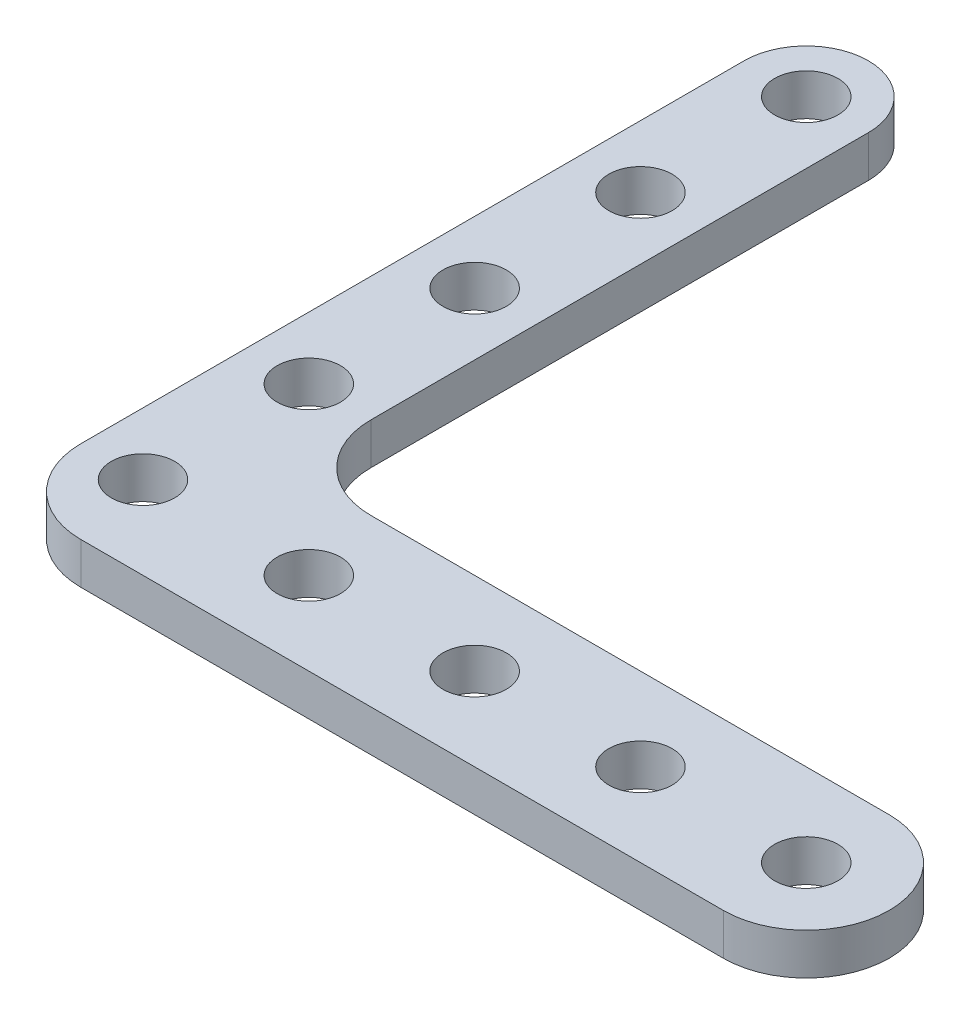
ISO-10303-21;
HEADER;
FILE_DESCRIPTION(('STEP AP214'),'2;1');
FILE_NAME('part.step','',(''),(''),'','','');
FILE_SCHEMA(('AUTOMOTIVE_DESIGN { 1 0 10303 214 1 1 1 1 }'));
ENDSEC;
DATA;
#1=APPLICATION_CONTEXT('core data for automotive mechanical design processes');
#2=APPLICATION_PROTOCOL_DEFINITION('international standard','automotive_design',2000,#1);
#3=PRODUCT_CONTEXT('',#1,'mechanical');
#4=PRODUCT('Part','Part','',(#3));
#5=PRODUCT_RELATED_PRODUCT_CATEGORY('part','',(#4));
#6=PRODUCT_DEFINITION_FORMATION('','',#4);
#7=PRODUCT_DEFINITION_CONTEXT('part definition',#1,'design');
#8=PRODUCT_DEFINITION('design','',#6,#7);
#9=PRODUCT_DEFINITION_SHAPE('','',#8);
#10=(LENGTH_UNIT() NAMED_UNIT(*) SI_UNIT(.MILLI.,.METRE.));
#11=(NAMED_UNIT(*) PLANE_ANGLE_UNIT() SI_UNIT($,.RADIAN.));
#12=(NAMED_UNIT(*) SI_UNIT($,.STERADIAN.) SOLID_ANGLE_UNIT());
#13=UNCERTAINTY_MEASURE_WITH_UNIT(LENGTH_MEASURE(1.E-05),#10,'distance_accuracy_value','');
#14=(GEOMETRIC_REPRESENTATION_CONTEXT(3) GLOBAL_UNCERTAINTY_ASSIGNED_CONTEXT((#13)) GLOBAL_UNIT_ASSIGNED_CONTEXT((#10,
#11,#12)) REPRESENTATION_CONTEXT('',''));
#15=CARTESIAN_POINT('',(0.,0.,0.));
#16=DIRECTION('',(0.,0.,1.));
#17=DIRECTION('',(1.,0.,0.));
#18=AXIS2_PLACEMENT_3D('',#15,#16,#17);
#19=CARTESIAN_POINT('',(-203.2,-28.575,1238.25));
#20=DIRECTION('',(0.,0.,1.));
#21=DIRECTION('',(1.,0.,0.));
#22=AXIS2_PLACEMENT_3D('',#19,#20,#21);
#23=PLANE('',#22);
#24=DIRECTION('',(1.,0.,0.));
#25=VECTOR('',#24,1.);
#26=CARTESIAN_POINT('',(-203.2,-25.4,1238.25));
#27=LINE('',#26,#25);
#28=CARTESIAN_POINT('',(-227.0125,-25.4,1238.25));
#29=VERTEX_POINT('',#28);
#30=CARTESIAN_POINT('',(-177.8,-25.4,1238.25));
#31=VERTEX_POINT('',#30);
#32=EDGE_CURVE('E146',#29,#31,#27,.T.);
#33=ORIENTED_EDGE('',*,*,#32,.F.);
#34=DIRECTION('',(0.,-1.,0.));
#35=VECTOR('',#34,1.);
#36=CARTESIAN_POINT('',(-227.0125,-28.575,1238.25));
#37=LINE('',#36,#35);
#38=CARTESIAN_POINT('',(-227.0125,-28.575,1238.25));
#39=VERTEX_POINT('',#38);
#40=EDGE_CURVE('E25',#29,#39,#37,.T.);
#41=ORIENTED_EDGE('',*,*,#40,.T.);
#42=DIRECTION('',(1.,0.,0.));
#43=VECTOR('',#42,1.);
#44=CARTESIAN_POINT('',(-203.2,-28.575,1238.25));
#45=LINE('',#44,#43);
#46=CARTESIAN_POINT('',(-177.8,-28.575,1238.25));
#47=VERTEX_POINT('',#46);
#48=EDGE_CURVE('E110',#39,#47,#45,.T.);
#49=ORIENTED_EDGE('',*,*,#48,.T.);
#50=DIRECTION('',(0.,1.,0.));
#51=VECTOR('',#50,1.);
#52=CARTESIAN_POINT('',(-177.8,-28.575,1238.25));
#53=LINE('',#52,#51);
#54=EDGE_CURVE('E92',#47,#31,#53,.T.);
#55=ORIENTED_EDGE('',*,*,#54,.T.);
#56=EDGE_LOOP('',(#33,#41,#49,#55));
#57=FACE_BOUND('',#56,.T.);
#58=ADVANCED_FACE('F17',(#57),#23,.T.);
#59=CARTESIAN_POINT('',(-233.3625,-28.575,1206.5));
#60=DIRECTION('',(-1.,0.,0.));
#61=DIRECTION('',(0.,0.,1.));
#62=AXIS2_PLACEMENT_3D('',#59,#60,#61);
#63=PLANE('',#62);
#64=DIRECTION('',(0.,0.,1.));
#65=VECTOR('',#64,1.);
#66=CARTESIAN_POINT('',(-233.3625,-25.4,1206.5));
#67=LINE('',#66,#65);
#68=CARTESIAN_POINT('',(-233.3625,-25.4,1181.1));
#69=VERTEX_POINT('',#68);
#70=CARTESIAN_POINT('',(-233.3625,-25.4,1231.9));
#71=VERTEX_POINT('',#70);
#72=EDGE_CURVE('E163',#69,#71,#67,.T.);
#73=ORIENTED_EDGE('',*,*,#72,.F.);
#74=DIRECTION('',(0.,1.,0.));
#75=VECTOR('',#74,1.);
#76=CARTESIAN_POINT('',(-233.3625,-28.575,1181.1));
#77=LINE('',#76,#75);
#78=CARTESIAN_POINT('',(-233.3625,-28.575,1181.1));
#79=VERTEX_POINT('',#78);
#80=EDGE_CURVE('E194',#79,#69,#77,.T.);
#81=ORIENTED_EDGE('',*,*,#80,.F.);
#82=DIRECTION('',(0.,0.,1.));
#83=VECTOR('',#82,1.);
#84=CARTESIAN_POINT('',(-233.3625,-28.575,1206.5));
#85=LINE('',#84,#83);
#86=CARTESIAN_POINT('',(-233.3625,-28.575,1231.9));
#87=VERTEX_POINT('',#86);
#88=EDGE_CURVE('E122',#79,#87,#85,.T.);
#89=ORIENTED_EDGE('',*,*,#88,.T.);
#90=DIRECTION('',(0.,1.,0.));
#91=VECTOR('',#90,1.);
#92=CARTESIAN_POINT('',(-233.3625,-28.575,1231.9));
#93=LINE('',#92,#91);
#94=EDGE_CURVE('E196',#87,#71,#93,.T.);
#95=ORIENTED_EDGE('',*,*,#94,.T.);
#96=EDGE_LOOP('',(#73,#81,#89,#95));
#97=FACE_BOUND('',#96,.T.);
#98=ADVANCED_FACE('F213',(#97),#63,.T.);
#99=CARTESIAN_POINT('',(-228.6,-28.575,1181.1));
#100=DIRECTION('',(0.,1.,0.));
#101=DIRECTION('',(0.,0.,1.));
#102=AXIS2_PLACEMENT_3D('',#99,#100,#101);
#103=CYLINDRICAL_SURFACE('',#102,4.7625);
#104=CARTESIAN_POINT('',(-228.6,-25.4,1181.1));
#105=DIRECTION('',(0.,-1.,0.));
#106=DIRECTION('',(0.,0.,-1.));
#107=AXIS2_PLACEMENT_3D('',#104,#105,#106);
#108=CIRCLE('',#107,4.7625);
#109=CARTESIAN_POINT('',(-223.8375,-25.4,1181.1));
#110=VERTEX_POINT('',#109);
#111=EDGE_CURVE('E165',#69,#110,#108,.T.);
#112=ORIENTED_EDGE('',*,*,#111,.T.);
#113=DIRECTION('',(0.,1.,0.));
#114=VECTOR('',#113,1.);
#115=CARTESIAN_POINT('',(-223.8375,-28.575,1181.1));
#116=LINE('',#115,#114);
#117=CARTESIAN_POINT('',(-223.8375,-28.575,1181.1));
#118=VERTEX_POINT('',#117);
#119=EDGE_CURVE('E192',#118,#110,#116,.T.);
#120=ORIENTED_EDGE('',*,*,#119,.F.);
#121=CARTESIAN_POINT('',(-228.6,-28.575,1181.1));
#122=DIRECTION('',(0.,-1.,0.));
#123=DIRECTION('',(0.,0.,-1.));
#124=AXIS2_PLACEMENT_3D('',#121,#122,#123);
#125=CIRCLE('',#124,4.7625);
#126=EDGE_CURVE('E125',#79,#118,#125,.T.);
#127=ORIENTED_EDGE('',*,*,#126,.F.);
#128=ORIENTED_EDGE('',*,*,#80,.T.);
#129=EDGE_LOOP('',(#112,#120,#127,#128));
#130=FACE_BOUND('',#129,.T.);
#131=ADVANCED_FACE('F219',(#130),#103,.T.);
#132=CARTESIAN_POINT('',(-223.8375,-28.575,1200.15));
#133=DIRECTION('',(1.,0.,0.));
#134=DIRECTION('',(0.,0.,-1.));
#135=AXIS2_PLACEMENT_3D('',#132,#133,#134);
#136=PLANE('',#135);
#137=DIRECTION('',(0.,0.,-1.));
#138=VECTOR('',#137,1.);
#139=CARTESIAN_POINT('',(-223.8375,-25.4,1200.15));
#140=LINE('',#139,#138);
#141=CARTESIAN_POINT('',(-223.8375,-25.4,1219.2));
#142=VERTEX_POINT('',#141);
#143=EDGE_CURVE('E168',#142,#110,#140,.T.);
#144=ORIENTED_EDGE('',*,*,#143,.F.);
#145=DIRECTION('',(0.,1.,0.));
#146=VECTOR('',#145,1.);
#147=CARTESIAN_POINT('',(-223.8375,-28.575,1219.2));
#148=LINE('',#147,#146);
#149=CARTESIAN_POINT('',(-223.8375,-28.575,1219.2));
#150=VERTEX_POINT('',#149);
#151=EDGE_CURVE('E190',#150,#142,#148,.T.);
#152=ORIENTED_EDGE('',*,*,#151,.F.);
#153=DIRECTION('',(0.,0.,-1.));
#154=VECTOR('',#153,1.);
#155=CARTESIAN_POINT('',(-223.8375,-28.575,1200.15));
#156=LINE('',#155,#154);
#157=EDGE_CURVE('E127',#150,#118,#156,.T.);
#158=ORIENTED_EDGE('',*,*,#157,.T.);
#159=ORIENTED_EDGE('',*,*,#119,.T.);
#160=EDGE_LOOP('',(#144,#152,#158,#159));
#161=FACE_BOUND('',#160,.T.);
#162=ADVANCED_FACE('F207',(#161),#136,.T.);
#163=CARTESIAN_POINT('',(-217.4875,-28.575,1219.2));
#164=DIRECTION('',(0.,1.,0.));
#165=DIRECTION('',(0.,0.,1.));
#166=AXIS2_PLACEMENT_3D('',#163,#164,#165);
#167=CYLINDRICAL_SURFACE('',#166,6.35);
#168=CARTESIAN_POINT('',(-217.4875,-25.4,1219.2));
#169=DIRECTION('',(0.,-1.,0.));
#170=DIRECTION('',(0.,0.,-1.));
#171=AXIS2_PLACEMENT_3D('',#168,#169,#170);
#172=CIRCLE('',#171,6.35);
#173=CARTESIAN_POINT('',(-217.4875,-25.4,1225.55));
#174=VERTEX_POINT('',#173);
#175=EDGE_CURVE('E171',#174,#142,#172,.T.);
#176=ORIENTED_EDGE('',*,*,#175,.F.);
#177=DIRECTION('',(0.,1.,0.));
#178=VECTOR('',#177,1.);
#179=CARTESIAN_POINT('',(-217.4875,-28.575,1225.55));
#180=LINE('',#179,#178);
#181=CARTESIAN_POINT('',(-217.4875,-28.575,1225.55));
#182=VERTEX_POINT('',#181);
#183=EDGE_CURVE('E91',#182,#174,#180,.T.);
#184=ORIENTED_EDGE('',*,*,#183,.F.);
#185=CARTESIAN_POINT('',(-217.4875,-28.575,1219.2));
#186=DIRECTION('',(0.,-1.,0.));
#187=DIRECTION('',(0.,0.,-1.));
#188=AXIS2_PLACEMENT_3D('',#185,#186,#187);
#189=CIRCLE('',#188,6.35);
#190=EDGE_CURVE('E106',#182,#150,#189,.T.);
#191=ORIENTED_EDGE('',*,*,#190,.T.);
#192=ORIENTED_EDGE('',*,*,#151,.T.);
#193=EDGE_LOOP('',(#176,#184,#191,#192));
#194=FACE_BOUND('',#193,.T.);
#195=ADVANCED_FACE('F204',(#194),#167,.F.);
#196=CARTESIAN_POINT('',(-197.64375,-28.575,1225.55));
#197=DIRECTION('',(0.,0.,-1.));
#198=DIRECTION('',(-1.,0.,0.));
#199=AXIS2_PLACEMENT_3D('',#196,#197,#198);
#200=PLANE('',#199);
#201=DIRECTION('',(-1.,0.,0.));
#202=VECTOR('',#201,1.);
#203=CARTESIAN_POINT('',(-197.64375,-25.4,1225.55));
#204=LINE('',#203,#202);
#205=CARTESIAN_POINT('',(-177.8,-25.4,1225.55));
#206=VERTEX_POINT('',#205);
#207=EDGE_CURVE('E87',#206,#174,#204,.T.);
#208=ORIENTED_EDGE('',*,*,#207,.F.);
#209=DIRECTION('',(0.,1.,0.));
#210=VECTOR('',#209,1.);
#211=CARTESIAN_POINT('',(-177.8,-28.575,1225.55));
#212=LINE('',#211,#210);
#213=CARTESIAN_POINT('',(-177.8,-28.575,1225.55));
#214=VERTEX_POINT('',#213);
#215=EDGE_CURVE('E80',#214,#206,#212,.T.);
#216=ORIENTED_EDGE('',*,*,#215,.F.);
#217=DIRECTION('',(-1.,0.,0.));
#218=VECTOR('',#217,1.);
#219=CARTESIAN_POINT('',(-197.64375,-28.575,1225.55));
#220=LINE('',#219,#218);
#221=EDGE_CURVE('E84',#214,#182,#220,.T.);
#222=ORIENTED_EDGE('',*,*,#221,.T.);
#223=ORIENTED_EDGE('',*,*,#183,.T.);
#224=EDGE_LOOP('',(#208,#216,#222,#223));
#225=FACE_BOUND('',#224,.T.);
#226=ADVANCED_FACE('F82',(#225),#200,.T.);
#227=CARTESIAN_POINT('',(-228.6,-28.575,1206.5));
#228=DIRECTION('',(0.,1.,0.));
#229=DIRECTION('',(0.,0.,1.));
#230=AXIS2_PLACEMENT_3D('',#227,#228,#229);
#231=CYLINDRICAL_SURFACE('',#230,2.4257);
#232=CARTESIAN_POINT('',(-228.6,-28.575,1206.5));
#233=DIRECTION('',(0.,-1.,0.));
#234=DIRECTION('',(0.,0.,-1.));
#235=AXIS2_PLACEMENT_3D('',#232,#233,#234);
#236=CIRCLE('',#235,2.4257);
#237=CARTESIAN_POINT('',(-228.6,-28.575,1204.0743));
#238=VERTEX_POINT('',#237);
#239=EDGE_CURVE('E140',#238,#238,#236,.T.);
#240=ORIENTED_EDGE('',*,*,#239,.T.);
#241=EDGE_LOOP('',(#240));
#242=FACE_BOUND('',#241,.T.);
#243=CARTESIAN_POINT('',(-228.6,-25.4,1206.5));
#244=DIRECTION('',(0.,-1.,0.));
#245=DIRECTION('',(0.,0.,-1.));
#246=AXIS2_PLACEMENT_3D('',#243,#244,#245);
#247=CIRCLE('',#246,2.4257);
#248=CARTESIAN_POINT('',(-228.6,-25.4,1204.0743));
#249=VERTEX_POINT('',#248);
#250=EDGE_CURVE('E183',#249,#249,#247,.T.);
#251=ORIENTED_EDGE('',*,*,#250,.F.);
#252=EDGE_LOOP('',(#251));
#253=FACE_BOUND('',#252,.T.);
#254=ADVANCED_FACE('F240',(#242,#253),#231,.F.);
#255=CARTESIAN_POINT('',(-228.6,-28.575,1193.8));
#256=DIRECTION('',(0.,1.,0.));
#257=DIRECTION('',(0.,0.,1.));
#258=AXIS2_PLACEMENT_3D('',#255,#256,#257);
#259=CYLINDRICAL_SURFACE('',#258,2.4257);
#260=CARTESIAN_POINT('',(-228.6,-28.575,1193.8));
#261=DIRECTION('',(0.,-1.,0.));
#262=DIRECTION('',(0.,0.,-1.));
#263=AXIS2_PLACEMENT_3D('',#260,#261,#262);
#264=CIRCLE('',#263,2.4257);
#265=CARTESIAN_POINT('',(-228.6,-28.575,1191.3743));
#266=VERTEX_POINT('',#265);
#267=EDGE_CURVE('E137',#266,#266,#264,.T.);
#268=ORIENTED_EDGE('',*,*,#267,.T.);
#269=EDGE_LOOP('',(#268));
#270=FACE_BOUND('',#269,.T.);
#271=CARTESIAN_POINT('',(-228.6,-25.4,1193.8));
#272=DIRECTION('',(0.,-1.,0.));
#273=DIRECTION('',(0.,0.,-1.));
#274=AXIS2_PLACEMENT_3D('',#271,#272,#273);
#275=CIRCLE('',#274,2.4257);
#276=CARTESIAN_POINT('',(-228.6,-25.4,1191.3743));
#277=VERTEX_POINT('',#276);
#278=EDGE_CURVE('E180',#277,#277,#275,.T.);
#279=ORIENTED_EDGE('',*,*,#278,.F.);
#280=EDGE_LOOP('',(#279));
#281=FACE_BOUND('',#280,.T.);
#282=ADVANCED_FACE('F290',(#270,#281),#259,.F.);
#283=CARTESIAN_POINT('',(-228.6,-28.575,1181.1));
#284=DIRECTION('',(0.,1.,0.));
#285=DIRECTION('',(0.,0.,1.));
#286=AXIS2_PLACEMENT_3D('',#283,#284,#285);
#287=CYLINDRICAL_SURFACE('',#286,2.4257);
#288=CARTESIAN_POINT('',(-228.6,-28.575,1181.1));
#289=DIRECTION('',(0.,-1.,0.));
#290=DIRECTION('',(0.,0.,-1.));
#291=AXIS2_PLACEMENT_3D('',#288,#289,#290);
#292=CIRCLE('',#291,2.4257);
#293=CARTESIAN_POINT('',(-228.6,-28.575,1178.6743));
#294=VERTEX_POINT('',#293);
#295=EDGE_CURVE('E134',#294,#294,#292,.T.);
#296=ORIENTED_EDGE('',*,*,#295,.T.);
#297=EDGE_LOOP('',(#296));
#298=FACE_BOUND('',#297,.T.);
#299=CARTESIAN_POINT('',(-228.6,-25.4,1181.1));
#300=DIRECTION('',(0.,-1.,0.));
#301=DIRECTION('',(0.,0.,-1.));
#302=AXIS2_PLACEMENT_3D('',#299,#300,#301);
#303=CIRCLE('',#302,2.4257);
#304=CARTESIAN_POINT('',(-228.6,-25.4,1178.6743));
#305=VERTEX_POINT('',#304);
#306=EDGE_CURVE('E177',#305,#305,#303,.T.);
#307=ORIENTED_EDGE('',*,*,#306,.F.);
#308=EDGE_LOOP('',(#307));
#309=FACE_BOUND('',#308,.T.);
#310=ADVANCED_FACE('F258',(#298,#309),#287,.F.);
#311=CARTESIAN_POINT('',(-228.6,-28.575,1231.9));
#312=DIRECTION('',(0.,1.,0.));
#313=DIRECTION('',(0.,0.,1.));
#314=AXIS2_PLACEMENT_3D('',#311,#312,#313);
#315=CYLINDRICAL_SURFACE('',#314,2.4257);
#316=CARTESIAN_POINT('',(-228.6,-28.575,1231.9));
#317=DIRECTION('',(0.,-1.,0.));
#318=DIRECTION('',(0.,0.,-1.));
#319=AXIS2_PLACEMENT_3D('',#316,#317,#318);
#320=CIRCLE('',#319,2.4257);
#321=CARTESIAN_POINT('',(-228.6,-28.575,1229.4743));
#322=VERTEX_POINT('',#321);
#323=EDGE_CURVE('E131',#322,#322,#320,.T.);
#324=ORIENTED_EDGE('',*,*,#323,.T.);
#325=EDGE_LOOP('',(#324));
#326=FACE_BOUND('',#325,.T.);
#327=CARTESIAN_POINT('',(-228.6,-25.4,1231.9));
#328=DIRECTION('',(0.,-1.,0.));
#329=DIRECTION('',(0.,0.,-1.));
#330=AXIS2_PLACEMENT_3D('',#327,#328,#329);
#331=CIRCLE('',#330,2.4257);
#332=CARTESIAN_POINT('',(-228.6,-25.4,1229.4743));
#333=VERTEX_POINT('',#332);
#334=EDGE_CURVE('E174',#333,#333,#331,.T.);
#335=ORIENTED_EDGE('',*,*,#334,.F.);
#336=EDGE_LOOP('',(#335));
#337=FACE_BOUND('',#336,.T.);
#338=ADVANCED_FACE('F253',(#326,#337),#315,.F.);
#339=CARTESIAN_POINT('',(-177.8,-28.575,1231.9));
#340=DIRECTION('',(0.,1.,0.));
#341=DIRECTION('',(0.,0.,1.));
#342=AXIS2_PLACEMENT_3D('',#339,#340,#341);
#343=CYLINDRICAL_SURFACE('',#342,2.4257);
#344=CARTESIAN_POINT('',(-177.8,-28.575,1231.9));
#345=DIRECTION('',(0.,-1.,0.));
#346=DIRECTION('',(0.,0.,-1.));
#347=AXIS2_PLACEMENT_3D('',#344,#345,#346);
#348=CIRCLE('',#347,2.4257);
#349=CARTESIAN_POINT('',(-177.8,-28.575,1229.4743));
#350=VERTEX_POINT('',#349);
#351=EDGE_CURVE('E119',#350,#350,#348,.T.);
#352=ORIENTED_EDGE('',*,*,#351,.T.);
#353=EDGE_LOOP('',(#352));
#354=FACE_BOUND('',#353,.T.);
#355=CARTESIAN_POINT('',(-177.8,-25.4,1231.9));
#356=DIRECTION('',(0.,-1.,0.));
#357=DIRECTION('',(0.,0.,-1.));
#358=AXIS2_PLACEMENT_3D('',#355,#356,#357);
#359=CIRCLE('',#358,2.4257);
#360=CARTESIAN_POINT('',(-177.8,-25.4,1229.4743));
#361=VERTEX_POINT('',#360);
#362=EDGE_CURVE('E160',#361,#361,#359,.T.);
#363=ORIENTED_EDGE('',*,*,#362,.F.);
#364=EDGE_LOOP('',(#363));
#365=FACE_BOUND('',#364,.T.);
#366=ADVANCED_FACE('F250',(#354,#365),#343,.F.);
#367=CARTESIAN_POINT('',(-190.5,-28.575,1231.9));
#368=DIRECTION('',(0.,1.,0.));
#369=DIRECTION('',(0.,0.,1.));
#370=AXIS2_PLACEMENT_3D('',#367,#368,#369);
#371=CYLINDRICAL_SURFACE('',#370,2.4257);
#372=CARTESIAN_POINT('',(-190.5,-28.575,1231.9));
#373=DIRECTION('',(0.,-1.,0.));
#374=DIRECTION('',(0.,0.,-1.));
#375=AXIS2_PLACEMENT_3D('',#372,#373,#374);
#376=CIRCLE('',#375,2.4257);
#377=CARTESIAN_POINT('',(-190.5,-28.575,1229.4743));
#378=VERTEX_POINT('',#377);
#379=EDGE_CURVE('E116',#378,#378,#376,.T.);
#380=ORIENTED_EDGE('',*,*,#379,.T.);
#381=EDGE_LOOP('',(#380));
#382=FACE_BOUND('',#381,.T.);
#383=CARTESIAN_POINT('',(-190.5,-25.4,1231.9));
#384=DIRECTION('',(0.,-1.,0.));
#385=DIRECTION('',(0.,0.,-1.));
#386=AXIS2_PLACEMENT_3D('',#383,#384,#385);
#387=CIRCLE('',#386,2.4257);
#388=CARTESIAN_POINT('',(-190.5,-25.4,1229.4743));
#389=VERTEX_POINT('',#388);
#390=EDGE_CURVE('E157',#389,#389,#387,.T.);
#391=ORIENTED_EDGE('',*,*,#390,.F.);
#392=EDGE_LOOP('',(#391));
#393=FACE_BOUND('',#392,.T.);
#394=ADVANCED_FACE('F246',(#382,#393),#371,.F.);
#395=CARTESIAN_POINT('',(-203.2,-28.575,1231.9));
#396=DIRECTION('',(0.,1.,0.));
#397=DIRECTION('',(0.,0.,1.));
#398=AXIS2_PLACEMENT_3D('',#395,#396,#397);
#399=CYLINDRICAL_SURFACE('',#398,2.4257);
#400=CARTESIAN_POINT('',(-203.2,-28.575,1231.9));
#401=DIRECTION('',(0.,-1.,0.));
#402=DIRECTION('',(0.,0.,-1.));
#403=AXIS2_PLACEMENT_3D('',#400,#401,#402);
#404=CIRCLE('',#403,2.4257);
#405=CARTESIAN_POINT('',(-203.2,-28.575,1229.4743));
#406=VERTEX_POINT('',#405);
#407=EDGE_CURVE('E100',#406,#406,#404,.T.);
#408=ORIENTED_EDGE('',*,*,#407,.T.);
#409=EDGE_LOOP('',(#408));
#410=FACE_BOUND('',#409,.T.);
#411=CARTESIAN_POINT('',(-203.2,-25.4,1231.9));
#412=DIRECTION('',(0.,-1.,0.));
#413=DIRECTION('',(0.,0.,-1.));
#414=AXIS2_PLACEMENT_3D('',#411,#412,#413);
#415=CIRCLE('',#414,2.4257);
#416=CARTESIAN_POINT('',(-203.2,-25.4,1229.4743));
#417=VERTEX_POINT('',#416);
#418=EDGE_CURVE('E154',#417,#417,#415,.T.);
#419=ORIENTED_EDGE('',*,*,#418,.F.);
#420=EDGE_LOOP('',(#419));
#421=FACE_BOUND('',#420,.T.);
#422=ADVANCED_FACE('F243',(#410,#421),#399,.F.);
#423=CARTESIAN_POINT('',(-177.8,-28.575,1231.9));
#424=DIRECTION('',(0.,1.,0.));
#425=DIRECTION('',(0.,0.,1.));
#426=AXIS2_PLACEMENT_3D('',#423,#424,#425);
#427=CYLINDRICAL_SURFACE('',#426,6.35000000000008);
#428=CARTESIAN_POINT('',(-177.8,-25.4,1231.9));
#429=DIRECTION('',(0.,-1.,0.));
#430=DIRECTION('',(0.,0.,-1.));
#431=AXIS2_PLACEMENT_3D('',#428,#429,#430);
#432=CIRCLE('',#431,6.35000000000008);
#433=EDGE_CURVE('E152',#206,#31,#432,.T.);
#434=ORIENTED_EDGE('',*,*,#433,.T.);
#435=ORIENTED_EDGE('',*,*,#54,.F.);
#436=CARTESIAN_POINT('',(-177.8,-28.575,1231.9));
#437=DIRECTION('',(0.,-1.,0.));
#438=DIRECTION('',(0.,0.,-1.));
#439=AXIS2_PLACEMENT_3D('',#436,#437,#438);
#440=CIRCLE('',#439,6.35000000000008);
#441=EDGE_CURVE('E96',#214,#47,#440,.T.);
#442=ORIENTED_EDGE('',*,*,#441,.F.);
#443=ORIENTED_EDGE('',*,*,#215,.T.);
#444=EDGE_LOOP('',(#434,#435,#442,#443));
#445=FACE_BOUND('',#444,.T.);
#446=ADVANCED_FACE('F97',(#445),#427,.T.);
#447=CARTESIAN_POINT('',(-215.9,-28.575,1231.9));
#448=DIRECTION('',(0.,1.,0.));
#449=DIRECTION('',(0.,0.,1.));
#450=AXIS2_PLACEMENT_3D('',#447,#448,#449);
#451=CYLINDRICAL_SURFACE('',#450,2.4257);
#452=CARTESIAN_POINT('',(-215.9,-28.575,1231.9));
#453=DIRECTION('',(0.,-1.,0.));
#454=DIRECTION('',(0.,0.,-1.));
#455=AXIS2_PLACEMENT_3D('',#452,#453,#454);
#456=CIRCLE('',#455,2.4257);
#457=CARTESIAN_POINT('',(-215.9,-28.575,1229.4743));
#458=VERTEX_POINT('',#457);
#459=EDGE_CURVE('E107',#458,#458,#456,.T.);
#460=ORIENTED_EDGE('',*,*,#459,.T.);
#461=EDGE_LOOP('',(#460));
#462=FACE_BOUND('',#461,.T.);
#463=CARTESIAN_POINT('',(-215.9,-25.4,1231.9));
#464=DIRECTION('',(0.,-1.,0.));
#465=DIRECTION('',(0.,0.,-1.));
#466=AXIS2_PLACEMENT_3D('',#463,#464,#465);
#467=CIRCLE('',#466,2.4257);
#468=CARTESIAN_POINT('',(-215.9,-25.4,1229.4743));
#469=VERTEX_POINT('',#468);
#470=EDGE_CURVE('E148',#469,#469,#467,.T.);
#471=ORIENTED_EDGE('',*,*,#470,.F.);
#472=EDGE_LOOP('',(#471));
#473=FACE_BOUND('',#472,.T.);
#474=ADVANCED_FACE('F233',(#462,#473),#451,.F.);
#475=CARTESIAN_POINT('',(-228.6,-28.575,1219.2));
#476=DIRECTION('',(0.,1.,0.));
#477=DIRECTION('',(0.,0.,1.));
#478=AXIS2_PLACEMENT_3D('',#475,#476,#477);
#479=CYLINDRICAL_SURFACE('',#478,2.4257);
#480=CARTESIAN_POINT('',(-228.6,-28.575,1219.2));
#481=DIRECTION('',(0.,-1.,0.));
#482=DIRECTION('',(0.,0.,-1.));
#483=AXIS2_PLACEMENT_3D('',#480,#481,#482);
#484=CIRCLE('',#483,2.4257);
#485=CARTESIAN_POINT('',(-228.6,-28.575,1216.7743));
#486=VERTEX_POINT('',#485);
#487=EDGE_CURVE('E143',#486,#486,#484,.T.);
#488=ORIENTED_EDGE('',*,*,#487,.T.);
#489=EDGE_LOOP('',(#488));
#490=FACE_BOUND('',#489,.T.);
#491=CARTESIAN_POINT('',(-228.6,-25.4,1219.2));
#492=DIRECTION('',(0.,-1.,0.));
#493=DIRECTION('',(0.,0.,-1.));
#494=AXIS2_PLACEMENT_3D('',#491,#492,#493);
#495=CIRCLE('',#494,2.4257);
#496=CARTESIAN_POINT('',(-228.6,-25.4,1216.7743));
#497=VERTEX_POINT('',#496);
#498=EDGE_CURVE('E186',#497,#497,#495,.T.);
#499=ORIENTED_EDGE('',*,*,#498,.F.);
#500=EDGE_LOOP('',(#499));
#501=FACE_BOUND('',#500,.T.);
#502=ADVANCED_FACE('F236',(#490,#501),#479,.F.);
#503=CARTESIAN_POINT('',(-206.375,-28.575,647.7));
#504=DIRECTION('',(0.,-1.,0.));
#505=DIRECTION('',(1.,0.,0.));
#506=AXIS2_PLACEMENT_3D('',#503,#504,#505);
#507=PLANE('',#506);
#508=ORIENTED_EDGE('',*,*,#459,.F.);
#509=EDGE_LOOP('',(#508));
#510=FACE_BOUND('',#509,.T.);
#511=ORIENTED_EDGE('',*,*,#48,.F.);
#512=CARTESIAN_POINT('',(-227.0125,-28.575,1231.9));
#513=DIRECTION('',(0.,-1.,0.));
#514=DIRECTION('',(0.,0.,-1.));
#515=AXIS2_PLACEMENT_3D('',#512,#513,#514);
#516=CIRCLE('',#515,6.35);
#517=EDGE_CURVE('E11',#39,#87,#516,.T.);
#518=ORIENTED_EDGE('',*,*,#517,.T.);
#519=ORIENTED_EDGE('',*,*,#88,.F.);
#520=ORIENTED_EDGE('',*,*,#126,.T.);
#521=ORIENTED_EDGE('',*,*,#157,.F.);
#522=ORIENTED_EDGE('',*,*,#190,.F.);
#523=ORIENTED_EDGE('',*,*,#221,.F.);
#524=ORIENTED_EDGE('',*,*,#441,.T.);
#525=EDGE_LOOP('',(#511,#518,#519,#520,#521,#522,#523,#524));
#526=FACE_BOUND('',#525,.T.);
#527=ORIENTED_EDGE('',*,*,#407,.F.);
#528=EDGE_LOOP('',(#527));
#529=FACE_BOUND('',#528,.T.);
#530=ORIENTED_EDGE('',*,*,#379,.F.);
#531=EDGE_LOOP('',(#530));
#532=FACE_BOUND('',#531,.T.);
#533=ORIENTED_EDGE('',*,*,#351,.F.);
#534=EDGE_LOOP('',(#533));
#535=FACE_BOUND('',#534,.T.);
#536=ORIENTED_EDGE('',*,*,#323,.F.);
#537=EDGE_LOOP('',(#536));
#538=FACE_BOUND('',#537,.T.);
#539=ORIENTED_EDGE('',*,*,#295,.F.);
#540=EDGE_LOOP('',(#539));
#541=FACE_BOUND('',#540,.T.);
#542=ORIENTED_EDGE('',*,*,#267,.F.);
#543=EDGE_LOOP('',(#542));
#544=FACE_BOUND('',#543,.T.);
#545=ORIENTED_EDGE('',*,*,#239,.F.);
#546=EDGE_LOOP('',(#545));
#547=FACE_BOUND('',#546,.T.);
#548=ORIENTED_EDGE('',*,*,#487,.F.);
#549=EDGE_LOOP('',(#548));
#550=FACE_BOUND('',#549,.T.);
#551=ADVANCED_FACE('F102',(#510,#526,#529,#532,#535,#538,#541,#544,#547,#550),#507,.T.);
#552=CARTESIAN_POINT('',(-206.375,-25.4,647.7));
#553=DIRECTION('',(0.,-1.,0.));
#554=DIRECTION('',(1.,0.,0.));
#555=AXIS2_PLACEMENT_3D('',#552,#553,#554);
#556=PLANE('',#555);
#557=ORIENTED_EDGE('',*,*,#470,.T.);
#558=EDGE_LOOP('',(#557));
#559=FACE_BOUND('',#558,.T.);
#560=ORIENTED_EDGE('',*,*,#72,.T.);
#561=CARTESIAN_POINT('',(-227.0125,-25.4,1231.9));
#562=DIRECTION('',(0.,-1.,0.));
#563=DIRECTION('',(0.,0.,-1.));
#564=AXIS2_PLACEMENT_3D('',#561,#562,#563);
#565=CIRCLE('',#564,6.35);
#566=EDGE_CURVE('E39',#71,#29,#565,.F.);
#567=ORIENTED_EDGE('',*,*,#566,.T.);
#568=ORIENTED_EDGE('',*,*,#32,.T.);
#569=ORIENTED_EDGE('',*,*,#433,.F.);
#570=ORIENTED_EDGE('',*,*,#207,.T.);
#571=ORIENTED_EDGE('',*,*,#175,.T.);
#572=ORIENTED_EDGE('',*,*,#143,.T.);
#573=ORIENTED_EDGE('',*,*,#111,.F.);
#574=EDGE_LOOP('',(#560,#567,#568,#569,#570,#571,#572,#573));
#575=FACE_BOUND('',#574,.T.);
#576=ORIENTED_EDGE('',*,*,#418,.T.);
#577=EDGE_LOOP('',(#576));
#578=FACE_BOUND('',#577,.T.);
#579=ORIENTED_EDGE('',*,*,#390,.T.);
#580=EDGE_LOOP('',(#579));
#581=FACE_BOUND('',#580,.T.);
#582=ORIENTED_EDGE('',*,*,#362,.T.);
#583=EDGE_LOOP('',(#582));
#584=FACE_BOUND('',#583,.T.);
#585=ORIENTED_EDGE('',*,*,#334,.T.);
#586=EDGE_LOOP('',(#585));
#587=FACE_BOUND('',#586,.T.);
#588=ORIENTED_EDGE('',*,*,#306,.T.);
#589=EDGE_LOOP('',(#588));
#590=FACE_BOUND('',#589,.T.);
#591=ORIENTED_EDGE('',*,*,#278,.T.);
#592=EDGE_LOOP('',(#591));
#593=FACE_BOUND('',#592,.T.);
#594=ORIENTED_EDGE('',*,*,#250,.T.);
#595=EDGE_LOOP('',(#594));
#596=FACE_BOUND('',#595,.T.);
#597=ORIENTED_EDGE('',*,*,#498,.T.);
#598=EDGE_LOOP('',(#597));
#599=FACE_BOUND('',#598,.T.);
#600=ADVANCED_FACE('F200',(#559,#575,#578,#581,#584,#587,#590,#593,#596,#599),#556,.F.);
#601=CARTESIAN_POINT('',(-227.0125,-28.575,1231.9));
#602=DIRECTION('',(0.,1.,0.));
#603=DIRECTION('',(0.,0.,1.));
#604=AXIS2_PLACEMENT_3D('',#601,#602,#603);
#605=CYLINDRICAL_SURFACE('',#604,6.35);
#606=ORIENTED_EDGE('',*,*,#517,.F.);
#607=ORIENTED_EDGE('',*,*,#40,.F.);
#608=ORIENTED_EDGE('',*,*,#566,.F.);
#609=ORIENTED_EDGE('',*,*,#94,.F.);
#610=EDGE_LOOP('',(#606,#607,#608,#609));
#611=FACE_BOUND('',#610,.T.);
#612=ADVANCED_FACE('F19',(#611),#605,.T.);
#613=CLOSED_SHELL('',(#58,#98,#131,#162,#195,#226,#254,#282,#310,#338,#366,#394,#422,#446,#474,
#502,#551,#600,#612));
#614=MANIFOLD_SOLID_BREP('B1',#613);
#615=ADVANCED_BREP_SHAPE_REPRESENTATION('',(#18,#614),#14);
#616=SHAPE_DEFINITION_REPRESENTATION(#9,#615);
ENDSEC;
END-ISO-10303-21;
